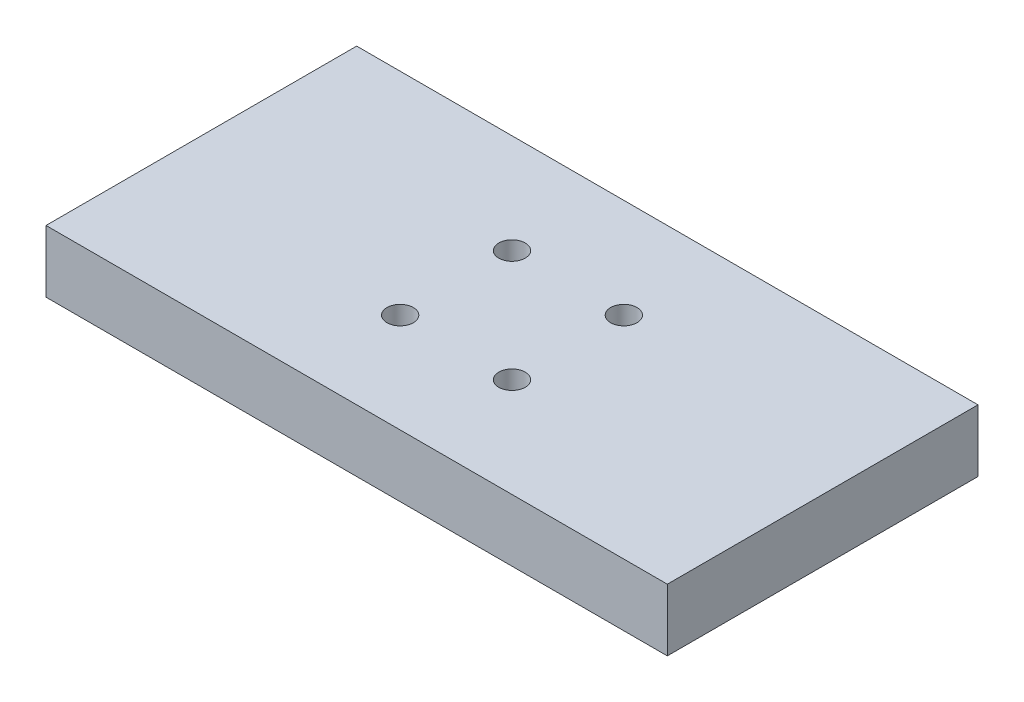
ISO-10303-21;
HEADER;
FILE_DESCRIPTION(('STEP AP214'),'2;1');
FILE_NAME('part.step','',(''),(''),'','','');
FILE_SCHEMA(('AUTOMOTIVE_DESIGN { 1 0 10303 214 1 1 1 1 }'));
ENDSEC;
DATA;
#1=APPLICATION_CONTEXT('core data for automotive mechanical design processes');
#2=APPLICATION_PROTOCOL_DEFINITION('international standard','automotive_design',2000,#1);
#3=PRODUCT_CONTEXT('',#1,'mechanical');
#4=PRODUCT('Part','Part','',(#3));
#5=PRODUCT_RELATED_PRODUCT_CATEGORY('part','',(#4));
#6=PRODUCT_DEFINITION_FORMATION('','',#4);
#7=PRODUCT_DEFINITION_CONTEXT('part definition',#1,'design');
#8=PRODUCT_DEFINITION('design','',#6,#7);
#9=PRODUCT_DEFINITION_SHAPE('','',#8);
#10=(LENGTH_UNIT() NAMED_UNIT(*) SI_UNIT(.MILLI.,.METRE.));
#11=(NAMED_UNIT(*) PLANE_ANGLE_UNIT() SI_UNIT($,.RADIAN.));
#12=(NAMED_UNIT(*) SI_UNIT($,.STERADIAN.) SOLID_ANGLE_UNIT());
#13=UNCERTAINTY_MEASURE_WITH_UNIT(LENGTH_MEASURE(1.E-05),#10,'distance_accuracy_value','');
#14=(GEOMETRIC_REPRESENTATION_CONTEXT(3) GLOBAL_UNCERTAINTY_ASSIGNED_CONTEXT((#13)) GLOBAL_UNIT_ASSIGNED_CONTEXT((#10,
#11,#12)) REPRESENTATION_CONTEXT('',''));
#15=CARTESIAN_POINT('',(0.,0.,0.));
#16=DIRECTION('',(0.,0.,1.));
#17=DIRECTION('',(1.,0.,0.));
#18=AXIS2_PLACEMENT_3D('',#15,#16,#17);
#19=CARTESIAN_POINT('',(100.,20.,-50.));
#20=DIRECTION('',(-1.,0.,0.));
#21=DIRECTION('',(0.,0.,1.));
#22=AXIS2_PLACEMENT_3D('',#19,#20,#21);
#23=PLANE('',#22);
#24=DIRECTION('',(0.,0.,-1.));
#25=VECTOR('',#24,1.);
#26=CARTESIAN_POINT('',(100.,0.,-50.));
#27=LINE('',#26,#25);
#28=CARTESIAN_POINT('',(100.,0.,50.));
#29=VERTEX_POINT('',#28);
#30=CARTESIAN_POINT('',(100.,0.,-50.));
#31=VERTEX_POINT('',#30);
#32=EDGE_CURVE('E100',#29,#31,#27,.T.);
#33=ORIENTED_EDGE('',*,*,#32,.T.);
#34=DIRECTION('',(0.,-1.,0.));
#35=VECTOR('',#34,1.);
#36=CARTESIAN_POINT('',(100.,20.,-50.));
#37=LINE('',#36,#35);
#38=CARTESIAN_POINT('',(100.,20.,-50.));
#39=VERTEX_POINT('',#38);
#40=EDGE_CURVE('E11',#39,#31,#37,.T.);
#41=ORIENTED_EDGE('',*,*,#40,.F.);
#42=DIRECTION('',(0.,0.,-1.));
#43=VECTOR('',#42,1.);
#44=CARTESIAN_POINT('',(100.,20.,-50.));
#45=LINE('',#44,#43);
#46=CARTESIAN_POINT('',(100.,20.,50.));
#47=VERTEX_POINT('',#46);
#48=EDGE_CURVE('E88',#47,#39,#45,.T.);
#49=ORIENTED_EDGE('',*,*,#48,.F.);
#50=DIRECTION('',(0.,-1.,0.));
#51=VECTOR('',#50,1.);
#52=CARTESIAN_POINT('',(100.,20.,50.));
#53=LINE('',#52,#51);
#54=EDGE_CURVE('E96',#47,#29,#53,.T.);
#55=ORIENTED_EDGE('',*,*,#54,.T.);
#56=EDGE_LOOP('',(#33,#41,#49,#55));
#57=FACE_BOUND('',#56,.T.);
#58=ADVANCED_FACE('F37',(#57),#23,.F.);
#59=CARTESIAN_POINT('',(-100.,20.,-50.));
#60=DIRECTION('',(0.,0.,1.));
#61=DIRECTION('',(1.,0.,0.));
#62=AXIS2_PLACEMENT_3D('',#59,#60,#61);
#63=PLANE('',#62);
#64=DIRECTION('',(-1.,0.,0.));
#65=VECTOR('',#64,1.);
#66=CARTESIAN_POINT('',(-100.,0.,-50.));
#67=LINE('',#66,#65);
#68=CARTESIAN_POINT('',(-100.,0.,-50.));
#69=VERTEX_POINT('',#68);
#70=EDGE_CURVE('E92',#31,#69,#67,.T.);
#71=ORIENTED_EDGE('',*,*,#70,.T.);
#72=DIRECTION('',(0.,-1.,0.));
#73=VECTOR('',#72,1.);
#74=CARTESIAN_POINT('',(-100.,20.,-50.));
#75=LINE('',#74,#73);
#76=CARTESIAN_POINT('',(-100.,20.,-50.));
#77=VERTEX_POINT('',#76);
#78=EDGE_CURVE('E45',#77,#69,#75,.T.);
#79=ORIENTED_EDGE('',*,*,#78,.F.);
#80=DIRECTION('',(-1.,0.,0.));
#81=VECTOR('',#80,1.);
#82=CARTESIAN_POINT('',(-100.,20.,-50.));
#83=LINE('',#82,#81);
#84=EDGE_CURVE('E83',#39,#77,#83,.T.);
#85=ORIENTED_EDGE('',*,*,#84,.F.);
#86=ORIENTED_EDGE('',*,*,#40,.T.);
#87=EDGE_LOOP('',(#71,#79,#85,#86));
#88=FACE_BOUND('',#87,.T.);
#89=ADVANCED_FACE('F91',(#88),#63,.F.);
#90=CARTESIAN_POINT('',(-100.,20.,-50.));
#91=DIRECTION('',(1.,0.,0.));
#92=DIRECTION('',(0.,0.,-1.));
#93=AXIS2_PLACEMENT_3D('',#90,#91,#92);
#94=PLANE('',#93);
#95=DIRECTION('',(0.,0.,1.));
#96=VECTOR('',#95,1.);
#97=CARTESIAN_POINT('',(-100.,0.,-50.));
#98=LINE('',#97,#96);
#99=CARTESIAN_POINT('',(-100.,0.,50.));
#100=VERTEX_POINT('',#99);
#101=EDGE_CURVE('E70',#69,#100,#98,.T.);
#102=ORIENTED_EDGE('',*,*,#101,.T.);
#103=DIRECTION('',(0.,-1.,0.));
#104=VECTOR('',#103,1.);
#105=CARTESIAN_POINT('',(-100.,20.,50.));
#106=LINE('',#105,#104);
#107=CARTESIAN_POINT('',(-100.,20.,50.));
#108=VERTEX_POINT('',#107);
#109=EDGE_CURVE('E93',#108,#100,#106,.T.);
#110=ORIENTED_EDGE('',*,*,#109,.F.);
#111=DIRECTION('',(0.,0.,1.));
#112=VECTOR('',#111,1.);
#113=CARTESIAN_POINT('',(-100.,20.,-50.));
#114=LINE('',#113,#112);
#115=EDGE_CURVE('E86',#77,#108,#114,.T.);
#116=ORIENTED_EDGE('',*,*,#115,.F.);
#117=ORIENTED_EDGE('',*,*,#78,.T.);
#118=EDGE_LOOP('',(#102,#110,#116,#117));
#119=FACE_BOUND('',#118,.T.);
#120=ADVANCED_FACE('F94',(#119),#94,.F.);
#121=CARTESIAN_POINT('',(-100.,20.,50.));
#122=DIRECTION('',(0.,0.,-1.));
#123=DIRECTION('',(-1.,0.,0.));
#124=AXIS2_PLACEMENT_3D('',#121,#122,#123);
#125=PLANE('',#124);
#126=DIRECTION('',(1.,0.,0.));
#127=VECTOR('',#126,1.);
#128=CARTESIAN_POINT('',(-100.,0.,50.));
#129=LINE('',#128,#127);
#130=EDGE_CURVE('E76',#100,#29,#129,.T.);
#131=ORIENTED_EDGE('',*,*,#130,.T.);
#132=ORIENTED_EDGE('',*,*,#54,.F.);
#133=DIRECTION('',(1.,0.,0.));
#134=VECTOR('',#133,1.);
#135=CARTESIAN_POINT('',(-100.,20.,50.));
#136=LINE('',#135,#134);
#137=EDGE_CURVE('E53',#108,#47,#136,.T.);
#138=ORIENTED_EDGE('',*,*,#137,.F.);
#139=ORIENTED_EDGE('',*,*,#109,.T.);
#140=EDGE_LOOP('',(#131,#132,#138,#139));
#141=FACE_BOUND('',#140,.T.);
#142=ADVANCED_FACE('F108',(#141),#125,.F.);
#143=CARTESIAN_POINT('',(0.,20.,0.));
#144=DIRECTION('',(0.,1.,0.));
#145=DIRECTION('',(0.,0.,1.));
#146=AXIS2_PLACEMENT_3D('',#143,#144,#145);
#147=PLANE('',#146);
#148=CARTESIAN_POINT('',(-18.,20.,-18.));
#149=DIRECTION('',(0.,-1.,0.));
#150=DIRECTION('',(0.,0.,-1.));
#151=AXIS2_PLACEMENT_3D('',#148,#149,#150);
#152=CIRCLE('',#151,4.25);
#153=CARTESIAN_POINT('',(-18.,20.,-22.25));
#154=VERTEX_POINT('',#153);
#155=EDGE_CURVE('E153',#154,#154,#152,.T.);
#156=ORIENTED_EDGE('',*,*,#155,.T.);
#157=EDGE_LOOP('',(#156));
#158=FACE_BOUND('',#157,.T.);
#159=CARTESIAN_POINT('',(18.,20.,-18.));
#160=DIRECTION('',(0.,-1.,0.));
#161=DIRECTION('',(0.,0.,-1.));
#162=AXIS2_PLACEMENT_3D('',#159,#160,#161);
#163=CIRCLE('',#162,4.25);
#164=CARTESIAN_POINT('',(18.,20.,-22.25));
#165=VERTEX_POINT('',#164);
#166=EDGE_CURVE('E147',#165,#165,#163,.T.);
#167=ORIENTED_EDGE('',*,*,#166,.T.);
#168=EDGE_LOOP('',(#167));
#169=FACE_BOUND('',#168,.T.);
#170=CARTESIAN_POINT('',(18.,20.,18.));
#171=DIRECTION('',(0.,-1.,0.));
#172=DIRECTION('',(0.,0.,-1.));
#173=AXIS2_PLACEMENT_3D('',#170,#171,#172);
#174=CIRCLE('',#173,4.25);
#175=CARTESIAN_POINT('',(18.,20.,13.75));
#176=VERTEX_POINT('',#175);
#177=EDGE_CURVE('E141',#176,#176,#174,.T.);
#178=ORIENTED_EDGE('',*,*,#177,.T.);
#179=EDGE_LOOP('',(#178));
#180=FACE_BOUND('',#179,.T.);
#181=CARTESIAN_POINT('',(-18.,20.,18.));
#182=DIRECTION('',(0.,-1.,0.));
#183=DIRECTION('',(0.,0.,-1.));
#184=AXIS2_PLACEMENT_3D('',#181,#182,#183);
#185=CIRCLE('',#184,4.25);
#186=CARTESIAN_POINT('',(-18.,20.,13.75));
#187=VERTEX_POINT('',#186);
#188=EDGE_CURVE('E135',#187,#187,#185,.T.);
#189=ORIENTED_EDGE('',*,*,#188,.T.);
#190=EDGE_LOOP('',(#189));
#191=FACE_BOUND('',#190,.T.);
#192=ORIENTED_EDGE('',*,*,#48,.T.);
#193=ORIENTED_EDGE('',*,*,#84,.T.);
#194=ORIENTED_EDGE('',*,*,#115,.T.);
#195=ORIENTED_EDGE('',*,*,#137,.T.);
#196=EDGE_LOOP('',(#192,#193,#194,#195));
#197=FACE_BOUND('',#196,.T.);
#198=ADVANCED_FACE('F84',(#158,#169,#180,#191,#197),#147,.T.);
#199=CARTESIAN_POINT('',(0.,0.,0.));
#200=DIRECTION('',(0.,1.,0.));
#201=DIRECTION('',(0.,0.,1.));
#202=AXIS2_PLACEMENT_3D('',#199,#200,#201);
#203=PLANE('',#202);
#204=CARTESIAN_POINT('',(18.,0.,-18.));
#205=DIRECTION('',(0.,-1.,0.));
#206=DIRECTION('',(0.,0.,-1.));
#207=AXIS2_PLACEMENT_3D('',#204,#205,#206);
#208=CIRCLE('',#207,7.);
#209=CARTESIAN_POINT('',(18.,0.,-25.));
#210=VERTEX_POINT('',#209);
#211=EDGE_CURVE('E132',#210,#210,#208,.T.);
#212=ORIENTED_EDGE('',*,*,#211,.F.);
#213=EDGE_LOOP('',(#212));
#214=FACE_BOUND('',#213,.T.);
#215=CARTESIAN_POINT('',(18.,0.,18.));
#216=DIRECTION('',(0.,-1.,0.));
#217=DIRECTION('',(0.,0.,-1.));
#218=AXIS2_PLACEMENT_3D('',#215,#216,#217);
#219=CIRCLE('',#218,7.);
#220=CARTESIAN_POINT('',(18.,0.,11.));
#221=VERTEX_POINT('',#220);
#222=EDGE_CURVE('E126',#221,#221,#219,.T.);
#223=ORIENTED_EDGE('',*,*,#222,.F.);
#224=EDGE_LOOP('',(#223));
#225=FACE_BOUND('',#224,.T.);
#226=CARTESIAN_POINT('',(-18.,0.,-18.));
#227=DIRECTION('',(0.,-1.,0.));
#228=DIRECTION('',(0.,0.,-1.));
#229=AXIS2_PLACEMENT_3D('',#226,#227,#228);
#230=CIRCLE('',#229,7.);
#231=CARTESIAN_POINT('',(-18.,0.,-25.));
#232=VERTEX_POINT('',#231);
#233=EDGE_CURVE('E120',#232,#232,#230,.T.);
#234=ORIENTED_EDGE('',*,*,#233,.F.);
#235=EDGE_LOOP('',(#234));
#236=FACE_BOUND('',#235,.T.);
#237=CARTESIAN_POINT('',(-18.,0.,18.));
#238=DIRECTION('',(0.,-1.,0.));
#239=DIRECTION('',(0.,0.,-1.));
#240=AXIS2_PLACEMENT_3D('',#237,#238,#239);
#241=CIRCLE('',#240,7.);
#242=CARTESIAN_POINT('',(-18.,0.,11.));
#243=VERTEX_POINT('',#242);
#244=EDGE_CURVE('E114',#243,#243,#241,.T.);
#245=ORIENTED_EDGE('',*,*,#244,.F.);
#246=EDGE_LOOP('',(#245));
#247=FACE_BOUND('',#246,.T.);
#248=ORIENTED_EDGE('',*,*,#32,.F.);
#249=ORIENTED_EDGE('',*,*,#130,.F.);
#250=ORIENTED_EDGE('',*,*,#101,.F.);
#251=ORIENTED_EDGE('',*,*,#70,.F.);
#252=EDGE_LOOP('',(#248,#249,#250,#251));
#253=FACE_BOUND('',#252,.T.);
#254=ADVANCED_FACE('F111',(#214,#225,#236,#247,#253),#203,.F.);
#255=CARTESIAN_POINT('',(-18.,9.,18.));
#256=DIRECTION('',(0.,-1.,0.));
#257=DIRECTION('',(0.,0.,-1.));
#258=AXIS2_PLACEMENT_3D('',#255,#256,#257);
#259=CYLINDRICAL_SURFACE('',#258,7.);
#260=CARTESIAN_POINT('',(-18.,9.,18.));
#261=DIRECTION('',(0.,-1.,0.));
#262=DIRECTION('',(0.,0.,-1.));
#263=AXIS2_PLACEMENT_3D('',#260,#261,#262);
#264=CIRCLE('',#263,7.);
#265=CARTESIAN_POINT('',(-18.,9.,11.));
#266=VERTEX_POINT('',#265);
#267=EDGE_CURVE('E103',#266,#266,#264,.T.);
#268=ORIENTED_EDGE('',*,*,#267,.F.);
#269=EDGE_LOOP('',(#268));
#270=FACE_BOUND('',#269,.T.);
#271=ORIENTED_EDGE('',*,*,#244,.T.);
#272=EDGE_LOOP('',(#271));
#273=FACE_BOUND('',#272,.T.);
#274=ADVANCED_FACE('F187',(#270,#273),#259,.F.);
#275=CARTESIAN_POINT('',(-18.,9.,18.));
#276=DIRECTION('',(0.,-1.,0.));
#277=DIRECTION('',(0.,0.,-1.));
#278=AXIS2_PLACEMENT_3D('',#275,#276,#277);
#279=PLANE('',#278);
#280=CARTESIAN_POINT('',(-18.,9.,18.));
#281=DIRECTION('',(0.,-1.,0.));
#282=DIRECTION('',(0.,0.,-1.));
#283=AXIS2_PLACEMENT_3D('',#280,#281,#282);
#284=CIRCLE('',#283,4.25);
#285=CARTESIAN_POINT('',(-18.,9.,13.75));
#286=VERTEX_POINT('',#285);
#287=EDGE_CURVE('E138',#286,#286,#284,.T.);
#288=ORIENTED_EDGE('',*,*,#287,.F.);
#289=EDGE_LOOP('',(#288));
#290=FACE_BOUND('',#289,.T.);
#291=ORIENTED_EDGE('',*,*,#267,.T.);
#292=EDGE_LOOP('',(#291));
#293=FACE_BOUND('',#292,.T.);
#294=ADVANCED_FACE('F181',(#290,#293),#279,.T.);
#295=CARTESIAN_POINT('',(-18.,9.,-18.));
#296=DIRECTION('',(0.,-1.,0.));
#297=DIRECTION('',(0.,0.,-1.));
#298=AXIS2_PLACEMENT_3D('',#295,#296,#297);
#299=CYLINDRICAL_SURFACE('',#298,7.);
#300=CARTESIAN_POINT('',(-18.,9.,-18.));
#301=DIRECTION('',(0.,-1.,0.));
#302=DIRECTION('',(0.,0.,-1.));
#303=AXIS2_PLACEMENT_3D('',#300,#301,#302);
#304=CIRCLE('',#303,7.);
#305=CARTESIAN_POINT('',(-18.,9.,-25.));
#306=VERTEX_POINT('',#305);
#307=EDGE_CURVE('E117',#306,#306,#304,.T.);
#308=ORIENTED_EDGE('',*,*,#307,.F.);
#309=EDGE_LOOP('',(#308));
#310=FACE_BOUND('',#309,.T.);
#311=ORIENTED_EDGE('',*,*,#233,.T.);
#312=EDGE_LOOP('',(#311));
#313=FACE_BOUND('',#312,.T.);
#314=ADVANCED_FACE('F175',(#310,#313),#299,.F.);
#315=CARTESIAN_POINT('',(-18.,9.,-18.));
#316=DIRECTION('',(0.,-1.,0.));
#317=DIRECTION('',(0.,0.,-1.));
#318=AXIS2_PLACEMENT_3D('',#315,#316,#317);
#319=PLANE('',#318);
#320=CARTESIAN_POINT('',(-18.,9.,-18.));
#321=DIRECTION('',(0.,-1.,0.));
#322=DIRECTION('',(0.,0.,-1.));
#323=AXIS2_PLACEMENT_3D('',#320,#321,#322);
#324=CIRCLE('',#323,4.25);
#325=CARTESIAN_POINT('',(-18.,9.,-22.25));
#326=VERTEX_POINT('',#325);
#327=EDGE_CURVE('E156',#326,#326,#324,.T.);
#328=ORIENTED_EDGE('',*,*,#327,.F.);
#329=EDGE_LOOP('',(#328));
#330=FACE_BOUND('',#329,.T.);
#331=ORIENTED_EDGE('',*,*,#307,.T.);
#332=EDGE_LOOP('',(#331));
#333=FACE_BOUND('',#332,.T.);
#334=ADVANCED_FACE('F171',(#330,#333),#319,.T.);
#335=CARTESIAN_POINT('',(18.,9.,18.));
#336=DIRECTION('',(0.,-1.,0.));
#337=DIRECTION('',(0.,0.,-1.));
#338=AXIS2_PLACEMENT_3D('',#335,#336,#337);
#339=CYLINDRICAL_SURFACE('',#338,7.);
#340=CARTESIAN_POINT('',(18.,9.,18.));
#341=DIRECTION('',(0.,-1.,0.));
#342=DIRECTION('',(0.,0.,-1.));
#343=AXIS2_PLACEMENT_3D('',#340,#341,#342);
#344=CIRCLE('',#343,7.);
#345=CARTESIAN_POINT('',(18.,9.,11.));
#346=VERTEX_POINT('',#345);
#347=EDGE_CURVE('E123',#346,#346,#344,.T.);
#348=ORIENTED_EDGE('',*,*,#347,.F.);
#349=EDGE_LOOP('',(#348));
#350=FACE_BOUND('',#349,.T.);
#351=ORIENTED_EDGE('',*,*,#222,.T.);
#352=EDGE_LOOP('',(#351));
#353=FACE_BOUND('',#352,.T.);
#354=ADVANCED_FACE('F174',(#350,#353),#339,.F.);
#355=CARTESIAN_POINT('',(18.,9.,18.));
#356=DIRECTION('',(0.,-1.,0.));
#357=DIRECTION('',(0.,0.,-1.));
#358=AXIS2_PLACEMENT_3D('',#355,#356,#357);
#359=PLANE('',#358);
#360=CARTESIAN_POINT('',(18.,9.,18.));
#361=DIRECTION('',(0.,-1.,0.));
#362=DIRECTION('',(0.,0.,-1.));
#363=AXIS2_PLACEMENT_3D('',#360,#361,#362);
#364=CIRCLE('',#363,4.25);
#365=CARTESIAN_POINT('',(18.,9.,13.75));
#366=VERTEX_POINT('',#365);
#367=EDGE_CURVE('E144',#366,#366,#364,.T.);
#368=ORIENTED_EDGE('',*,*,#367,.F.);
#369=EDGE_LOOP('',(#368));
#370=FACE_BOUND('',#369,.T.);
#371=ORIENTED_EDGE('',*,*,#347,.T.);
#372=EDGE_LOOP('',(#371));
#373=FACE_BOUND('',#372,.T.);
#374=ADVANCED_FACE('F246',(#370,#373),#359,.T.);
#375=CARTESIAN_POINT('',(18.,9.,-18.));
#376=DIRECTION('',(0.,-1.,0.));
#377=DIRECTION('',(0.,0.,-1.));
#378=AXIS2_PLACEMENT_3D('',#375,#376,#377);
#379=CYLINDRICAL_SURFACE('',#378,7.);
#380=CARTESIAN_POINT('',(18.,9.,-18.));
#381=DIRECTION('',(0.,-1.,0.));
#382=DIRECTION('',(0.,0.,-1.));
#383=AXIS2_PLACEMENT_3D('',#380,#381,#382);
#384=CIRCLE('',#383,7.);
#385=CARTESIAN_POINT('',(18.,9.,-25.));
#386=VERTEX_POINT('',#385);
#387=EDGE_CURVE('E129',#386,#386,#384,.T.);
#388=ORIENTED_EDGE('',*,*,#387,.F.);
#389=EDGE_LOOP('',(#388));
#390=FACE_BOUND('',#389,.T.);
#391=ORIENTED_EDGE('',*,*,#211,.T.);
#392=EDGE_LOOP('',(#391));
#393=FACE_BOUND('',#392,.T.);
#394=ADVANCED_FACE('F254',(#390,#393),#379,.F.);
#395=CARTESIAN_POINT('',(18.,9.,-18.));
#396=DIRECTION('',(0.,-1.,0.));
#397=DIRECTION('',(0.,0.,-1.));
#398=AXIS2_PLACEMENT_3D('',#395,#396,#397);
#399=PLANE('',#398);
#400=CARTESIAN_POINT('',(18.,9.,-18.));
#401=DIRECTION('',(0.,-1.,0.));
#402=DIRECTION('',(0.,0.,-1.));
#403=AXIS2_PLACEMENT_3D('',#400,#401,#402);
#404=CIRCLE('',#403,4.25);
#405=CARTESIAN_POINT('',(18.,9.,-22.25));
#406=VERTEX_POINT('',#405);
#407=EDGE_CURVE('E150',#406,#406,#404,.T.);
#408=ORIENTED_EDGE('',*,*,#407,.F.);
#409=EDGE_LOOP('',(#408));
#410=FACE_BOUND('',#409,.T.);
#411=ORIENTED_EDGE('',*,*,#387,.T.);
#412=EDGE_LOOP('',(#411));
#413=FACE_BOUND('',#412,.T.);
#414=ADVANCED_FACE('F258',(#410,#413),#399,.T.);
#415=CARTESIAN_POINT('',(-18.,20.,18.));
#416=DIRECTION('',(0.,-1.,0.));
#417=DIRECTION('',(0.,0.,-1.));
#418=AXIS2_PLACEMENT_3D('',#415,#416,#417);
#419=CYLINDRICAL_SURFACE('',#418,4.25);
#420=ORIENTED_EDGE('',*,*,#188,.F.);
#421=EDGE_LOOP('',(#420));
#422=FACE_BOUND('',#421,.T.);
#423=ORIENTED_EDGE('',*,*,#287,.T.);
#424=EDGE_LOOP('',(#423));
#425=FACE_BOUND('',#424,.T.);
#426=ADVANCED_FACE('F271',(#422,#425),#419,.F.);
#427=CARTESIAN_POINT('',(18.,20.,18.));
#428=DIRECTION('',(0.,-1.,0.));
#429=DIRECTION('',(0.,0.,-1.));
#430=AXIS2_PLACEMENT_3D('',#427,#428,#429);
#431=CYLINDRICAL_SURFACE('',#430,4.25);
#432=ORIENTED_EDGE('',*,*,#177,.F.);
#433=EDGE_LOOP('',(#432));
#434=FACE_BOUND('',#433,.T.);
#435=ORIENTED_EDGE('',*,*,#367,.T.);
#436=EDGE_LOOP('',(#435));
#437=FACE_BOUND('',#436,.T.);
#438=ADVANCED_FACE('F278',(#434,#437),#431,.F.);
#439=CARTESIAN_POINT('',(18.,20.,-18.));
#440=DIRECTION('',(0.,-1.,0.));
#441=DIRECTION('',(0.,0.,-1.));
#442=AXIS2_PLACEMENT_3D('',#439,#440,#441);
#443=CYLINDRICAL_SURFACE('',#442,4.25);
#444=ORIENTED_EDGE('',*,*,#166,.F.);
#445=EDGE_LOOP('',(#444));
#446=FACE_BOUND('',#445,.T.);
#447=ORIENTED_EDGE('',*,*,#407,.T.);
#448=EDGE_LOOP('',(#447));
#449=FACE_BOUND('',#448,.T.);
#450=ADVANCED_FACE('F167',(#446,#449),#443,.F.);
#451=CARTESIAN_POINT('',(-18.,20.,-18.));
#452=DIRECTION('',(0.,-1.,0.));
#453=DIRECTION('',(0.,0.,-1.));
#454=AXIS2_PLACEMENT_3D('',#451,#452,#453);
#455=CYLINDRICAL_SURFACE('',#454,4.25);
#456=ORIENTED_EDGE('',*,*,#155,.F.);
#457=EDGE_LOOP('',(#456));
#458=FACE_BOUND('',#457,.T.);
#459=ORIENTED_EDGE('',*,*,#327,.T.);
#460=EDGE_LOOP('',(#459));
#461=FACE_BOUND('',#460,.T.);
#462=ADVANCED_FACE('F164',(#458,#461),#455,.F.);
#463=CLOSED_SHELL('',(#58,#89,#120,#142,#198,#254,#274,#294,#314,#334,#354,#374,#394,#414,#426,
#438,#450,#462));
#464=MANIFOLD_SOLID_BREP('B2',#463);
#465=ADVANCED_BREP_SHAPE_REPRESENTATION('',(#18,#464),#14);
#466=SHAPE_DEFINITION_REPRESENTATION(#9,#465);
ENDSEC;
END-ISO-10303-21;
